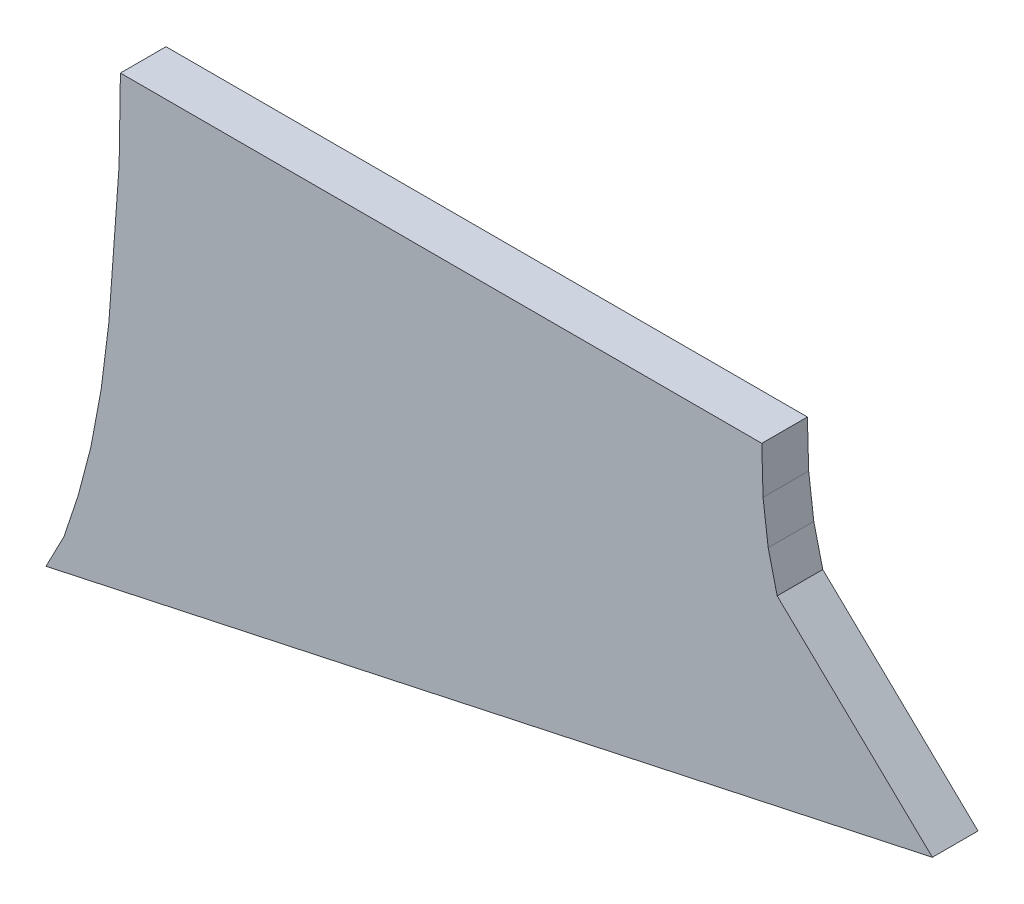
ISO-10303-21;
HEADER;
FILE_DESCRIPTION(('STEP AP214'),'2;1');
FILE_NAME('part.step','',(''),(''),'','','');
FILE_SCHEMA(('AUTOMOTIVE_DESIGN { 1 0 10303 214 1 1 1 1 }'));
ENDSEC;
DATA;
#1=APPLICATION_CONTEXT('core data for automotive mechanical design processes');
#2=APPLICATION_PROTOCOL_DEFINITION('international standard','automotive_design',2000,#1);
#3=PRODUCT_CONTEXT('',#1,'mechanical');
#4=PRODUCT('Part','Part','',(#3));
#5=PRODUCT_RELATED_PRODUCT_CATEGORY('part','',(#4));
#6=PRODUCT_DEFINITION_FORMATION('','',#4);
#7=PRODUCT_DEFINITION_CONTEXT('part definition',#1,'design');
#8=PRODUCT_DEFINITION('design','',#6,#7);
#9=PRODUCT_DEFINITION_SHAPE('','',#8);
#10=(LENGTH_UNIT() NAMED_UNIT(*) SI_UNIT(.MILLI.,.METRE.));
#11=(NAMED_UNIT(*) PLANE_ANGLE_UNIT() SI_UNIT($,.RADIAN.));
#12=(NAMED_UNIT(*) SI_UNIT($,.STERADIAN.) SOLID_ANGLE_UNIT());
#13=UNCERTAINTY_MEASURE_WITH_UNIT(LENGTH_MEASURE(1.E-05),#10,'distance_accuracy_value','');
#14=(GEOMETRIC_REPRESENTATION_CONTEXT(3) GLOBAL_UNCERTAINTY_ASSIGNED_CONTEXT((#13)) GLOBAL_UNIT_ASSIGNED_CONTEXT((#10,
#11,#12)) REPRESENTATION_CONTEXT('',''));
#15=CARTESIAN_POINT('',(0.,0.,0.));
#16=DIRECTION('',(0.,0.,1.));
#17=DIRECTION('',(1.,0.,0.));
#18=AXIS2_PLACEMENT_3D('',#15,#16,#17);
#19=CARTESIAN_POINT('',(78.4339981079102,67.2829971313477,0.));
#20=DIRECTION('',(0.999874169463245,-0.0158633300471945,0.));
#21=DIRECTION('',(-0.0158633300471945,-0.999874169463245,0.));
#22=AXIS2_PLACEMENT_3D('',#19,#20,#21);
#23=PLANE('',#22);
#24=DIRECTION('',(-0.0158633300471945,-0.999874169463245,0.));
#25=VECTOR('',#24,1.);
#26=CARTESIAN_POINT('',(78.4339981079102,67.2829971313477,0.03556));
#27=LINE('',#26,#25);
#28=CARTESIAN_POINT('',(78.4339981079102,67.2829971313477,0.03556));
#29=VERTEX_POINT('',#28);
#30=CARTESIAN_POINT('',(78.4329986572266,67.2200012207031,0.03556));
#31=VERTEX_POINT('',#30);
#32=EDGE_CURVE('E11',#29,#31,#27,.T.);
#33=ORIENTED_EDGE('',*,*,#32,.F.);
#34=DIRECTION('',(0.,0.,1.));
#35=VECTOR('',#34,1.);
#36=CARTESIAN_POINT('',(78.4339981079102,67.2829971313477,0.));
#37=LINE('',#36,#35);
#38=CARTESIAN_POINT('',(78.4339981079102,67.2829971313477,0.));
#39=VERTEX_POINT('',#38);
#40=EDGE_CURVE('E24',#39,#29,#37,.T.);
#41=ORIENTED_EDGE('',*,*,#40,.F.);
#42=DIRECTION('',(-0.0158633300471945,-0.999874169463245,0.));
#43=VECTOR('',#42,1.);
#44=CARTESIAN_POINT('',(78.4339981079102,67.2829971313477,0.));
#45=LINE('',#44,#43);
#46=CARTESIAN_POINT('',(78.4329986572266,67.2200012207031,0.));
#47=VERTEX_POINT('',#46);
#48=EDGE_CURVE('E130',#39,#47,#45,.T.);
#49=ORIENTED_EDGE('',*,*,#48,.T.);
#50=DIRECTION('',(0.,0.,1.));
#51=VECTOR('',#50,1.);
#52=CARTESIAN_POINT('',(78.4329986572266,67.2200012207031,0.));
#53=LINE('',#52,#51);
#54=EDGE_CURVE('E37',#47,#31,#53,.T.);
#55=ORIENTED_EDGE('',*,*,#54,.T.);
#56=EDGE_LOOP('',(#33,#41,#49,#55));
#57=FACE_BOUND('',#56,.T.);
#58=ADVANCED_FACE('F17',(#57),#23,.F.);
#59=CARTESIAN_POINT('',(78.4329986572266,67.2200012207031,0.));
#60=DIRECTION('',(0.997368727839487,-0.0724956600621294,0.));
#61=DIRECTION('',(-0.0724956600621294,-0.997368727839487,0.));
#62=AXIS2_PLACEMENT_3D('',#59,#60,#61);
#63=PLANE('',#62);
#64=DIRECTION('',(-0.0724956600621294,-0.997368727839487,0.));
#65=VECTOR('',#64,1.);
#66=CARTESIAN_POINT('',(78.4329986572266,67.2200012207031,0.03556));
#67=LINE('',#66,#65);
#68=CARTESIAN_POINT('',(78.4250030517578,67.1100006103516,0.03556));
#69=VERTEX_POINT('',#68);
#70=EDGE_CURVE('E210',#31,#69,#67,.T.);
#71=ORIENTED_EDGE('',*,*,#70,.F.);
#72=ORIENTED_EDGE('',*,*,#54,.F.);
#73=DIRECTION('',(-0.0724956600621294,-0.997368727839487,0.));
#74=VECTOR('',#73,1.);
#75=CARTESIAN_POINT('',(78.4329986572266,67.2200012207031,0.));
#76=LINE('',#75,#74);
#77=CARTESIAN_POINT('',(78.4250030517578,67.1100006103516,0.));
#78=VERTEX_POINT('',#77);
#79=EDGE_CURVE('E207',#47,#78,#76,.T.);
#80=ORIENTED_EDGE('',*,*,#79,.T.);
#81=DIRECTION('',(0.,0.,1.));
#82=VECTOR('',#81,1.);
#83=CARTESIAN_POINT('',(78.4250030517578,67.1100006103516,0.));
#84=LINE('',#83,#82);
#85=EDGE_CURVE('E205',#78,#69,#84,.T.);
#86=ORIENTED_EDGE('',*,*,#85,.T.);
#87=EDGE_LOOP('',(#71,#72,#80,#86));
#88=FACE_BOUND('',#87,.T.);
#89=ADVANCED_FACE('F218',(#88),#63,.F.);
#90=CARTESIAN_POINT('',(78.4250030517578,67.1100006103516,0.));
#91=DIRECTION('',(0.992268168867614,-0.124112372679404,0.));
#92=DIRECTION('',(-0.124112372679404,-0.992268168867614,0.));
#93=AXIS2_PLACEMENT_3D('',#90,#91,#92);
#94=PLANE('',#93);
#95=DIRECTION('',(-0.124112372679404,-0.992268168867614,0.));
#96=VECTOR('',#95,1.);
#97=CARTESIAN_POINT('',(78.4250030517578,67.1100006103516,0.03556));
#98=LINE('',#97,#96);
#99=CARTESIAN_POINT('',(78.4189987182617,67.0619964599609,0.03556));
#100=VERTEX_POINT('',#99);
#101=EDGE_CURVE('E202',#69,#100,#98,.T.);
#102=ORIENTED_EDGE('',*,*,#101,.F.);
#103=ORIENTED_EDGE('',*,*,#85,.F.);
#104=DIRECTION('',(-0.124112372679404,-0.992268168867614,0.));
#105=VECTOR('',#104,1.);
#106=CARTESIAN_POINT('',(78.4250030517578,67.1100006103516,0.));
#107=LINE('',#106,#105);
#108=CARTESIAN_POINT('',(78.4189987182617,67.0619964599609,0.));
#109=VERTEX_POINT('',#108);
#110=EDGE_CURVE('E199',#78,#109,#107,.T.);
#111=ORIENTED_EDGE('',*,*,#110,.T.);
#112=DIRECTION('',(0.,0.,1.));
#113=VECTOR('',#112,1.);
#114=CARTESIAN_POINT('',(78.4189987182617,67.0619964599609,0.));
#115=LINE('',#114,#113);
#116=EDGE_CURVE('E197',#109,#100,#115,.T.);
#117=ORIENTED_EDGE('',*,*,#116,.T.);
#118=EDGE_LOOP('',(#102,#103,#111,#117));
#119=FACE_BOUND('',#118,.T.);
#120=ADVANCED_FACE('F224',(#119),#94,.F.);
#121=CARTESIAN_POINT('',(78.4189987182617,67.0619964599609,0.));
#122=DIRECTION('',(0.983147552876486,-0.182813810400028,0.));
#123=DIRECTION('',(-0.182813810400028,-0.983147552876486,0.));
#124=AXIS2_PLACEMENT_3D('',#121,#122,#123);
#125=PLANE('',#124);
#126=DIRECTION('',(-0.182813810400028,-0.983147552876486,0.));
#127=VECTOR('',#126,1.);
#128=CARTESIAN_POINT('',(78.4189987182617,67.0619964599609,0.03556));
#129=LINE('',#128,#127);
#130=CARTESIAN_POINT('',(78.411003112793,67.0189971923828,0.03556));
#131=VERTEX_POINT('',#130);
#132=EDGE_CURVE('E194',#100,#131,#129,.T.);
#133=ORIENTED_EDGE('',*,*,#132,.F.);
#134=ORIENTED_EDGE('',*,*,#116,.F.);
#135=DIRECTION('',(-0.182813810400028,-0.983147552876486,0.));
#136=VECTOR('',#135,1.);
#137=CARTESIAN_POINT('',(78.4189987182617,67.0619964599609,0.));
#138=LINE('',#137,#136);
#139=CARTESIAN_POINT('',(78.411003112793,67.0189971923828,0.));
#140=VERTEX_POINT('',#139);
#141=EDGE_CURVE('E191',#109,#140,#138,.T.);
#142=ORIENTED_EDGE('',*,*,#141,.T.);
#143=DIRECTION('',(0.,0.,1.));
#144=VECTOR('',#143,1.);
#145=CARTESIAN_POINT('',(78.411003112793,67.0189971923828,0.));
#146=LINE('',#145,#144);
#147=EDGE_CURVE('E189',#140,#131,#146,.T.);
#148=ORIENTED_EDGE('',*,*,#147,.T.);
#149=EDGE_LOOP('',(#133,#134,#142,#148));
#150=FACE_BOUND('',#149,.T.);
#151=ADVANCED_FACE('F226',(#150),#125,.F.);
#152=CARTESIAN_POINT('',(78.411003112793,67.0189971923828,0.));
#153=DIRECTION('',(0.967051895040744,-0.254579324176389,0.));
#154=DIRECTION('',(-0.254579324176389,-0.967051895040744,0.));
#155=AXIS2_PLACEMENT_3D('',#152,#153,#154);
#156=PLANE('',#155);
#157=DIRECTION('',(-0.254579324176389,-0.967051895040744,0.));
#158=VECTOR('',#157,1.);
#159=CARTESIAN_POINT('',(78.411003112793,67.0189971923828,0.03556));
#160=LINE('',#159,#158);
#161=CARTESIAN_POINT('',(78.4010009765625,66.9810028076172,0.03556));
#162=VERTEX_POINT('',#161);
#163=EDGE_CURVE('E186',#131,#162,#160,.T.);
#164=ORIENTED_EDGE('',*,*,#163,.F.);
#165=ORIENTED_EDGE('',*,*,#147,.F.);
#166=DIRECTION('',(-0.254579324176389,-0.967051895040744,0.));
#167=VECTOR('',#166,1.);
#168=CARTESIAN_POINT('',(78.411003112793,67.0189971923828,0.));
#169=LINE('',#168,#167);
#170=CARTESIAN_POINT('',(78.4010009765625,66.9810028076172,0.));
#171=VERTEX_POINT('',#170);
#172=EDGE_CURVE('E183',#140,#171,#169,.T.);
#173=ORIENTED_EDGE('',*,*,#172,.T.);
#174=DIRECTION('',(0.,0.,1.));
#175=VECTOR('',#174,1.);
#176=CARTESIAN_POINT('',(78.4010009765625,66.9810028076172,0.));
#177=LINE('',#176,#175);
#178=EDGE_CURVE('E181',#171,#162,#177,.T.);
#179=ORIENTED_EDGE('',*,*,#178,.T.);
#180=EDGE_LOOP('',(#164,#165,#173,#179));
#181=FACE_BOUND('',#180,.T.);
#182=ADVANCED_FACE('F231',(#181),#156,.F.);
#183=CARTESIAN_POINT('',(78.4010009765625,66.9810028076172,0.));
#184=DIRECTION('',(0.948683298050514,-0.316227766016838,0.));
#185=DIRECTION('',(-0.316227766016838,-0.948683298050514,0.));
#186=AXIS2_PLACEMENT_3D('',#183,#184,#185);
#187=PLANE('',#186);
#188=DIRECTION('',(-0.316227766016838,-0.948683298050514,0.));
#189=VECTOR('',#188,1.);
#190=CARTESIAN_POINT('',(78.4010009765625,66.9810028076172,0.03556));
#191=LINE('',#190,#189);
#192=CARTESIAN_POINT('',(78.3899993896484,66.947998046875,0.03556));
#193=VERTEX_POINT('',#192);
#194=EDGE_CURVE('E178',#162,#193,#191,.T.);
#195=ORIENTED_EDGE('',*,*,#194,.F.);
#196=ORIENTED_EDGE('',*,*,#178,.F.);
#197=DIRECTION('',(-0.316227766016838,-0.948683298050514,0.));
#198=VECTOR('',#197,1.);
#199=CARTESIAN_POINT('',(78.4010009765625,66.9810028076172,0.));
#200=LINE('',#199,#198);
#201=CARTESIAN_POINT('',(78.3899993896484,66.947998046875,0.));
#202=VERTEX_POINT('',#201);
#203=EDGE_CURVE('E175',#171,#202,#200,.T.);
#204=ORIENTED_EDGE('',*,*,#203,.T.);
#205=DIRECTION('',(0.,0.,1.));
#206=VECTOR('',#205,1.);
#207=CARTESIAN_POINT('',(78.3899993896484,66.947998046875,0.));
#208=LINE('',#207,#206);
#209=EDGE_CURVE('E173',#202,#193,#208,.T.);
#210=ORIENTED_EDGE('',*,*,#209,.T.);
#211=EDGE_LOOP('',(#195,#196,#204,#210));
#212=FACE_BOUND('',#211,.T.);
#213=ADVANCED_FACE('F234',(#212),#187,.F.);
#214=CARTESIAN_POINT('',(78.3899993896484,66.947998046875,0.));
#215=DIRECTION('',(0.887758328068144,-0.460309842329767,0.));
#216=DIRECTION('',(-0.460309842329767,-0.887758328068144,0.));
#217=AXIS2_PLACEMENT_3D('',#214,#215,#216);
#218=PLANE('',#217);
#219=DIRECTION('',(-0.460309842329767,-0.887758328068144,0.));
#220=VECTOR('',#219,1.);
#221=CARTESIAN_POINT('',(78.3899993896484,66.947998046875,0.03556));
#222=LINE('',#221,#220);
#223=CARTESIAN_POINT('',(78.3759994506836,66.9209976196289,0.03556));
#224=VERTEX_POINT('',#223);
#225=EDGE_CURVE('E170',#193,#224,#222,.T.);
#226=ORIENTED_EDGE('',*,*,#225,.F.);
#227=ORIENTED_EDGE('',*,*,#209,.F.);
#228=DIRECTION('',(-0.460309842329767,-0.887758328068144,0.));
#229=VECTOR('',#228,1.);
#230=CARTESIAN_POINT('',(78.3899993896484,66.947998046875,0.));
#231=LINE('',#230,#229);
#232=CARTESIAN_POINT('',(78.3759994506836,66.9209976196289,0.));
#233=VERTEX_POINT('',#232);
#234=EDGE_CURVE('E167',#202,#233,#231,.T.);
#235=ORIENTED_EDGE('',*,*,#234,.T.);
#236=DIRECTION('',(0.,0.,1.));
#237=VECTOR('',#236,1.);
#238=CARTESIAN_POINT('',(78.3759994506836,66.9209976196289,0.));
#239=LINE('',#238,#237);
#240=EDGE_CURVE('E165',#233,#224,#239,.T.);
#241=ORIENTED_EDGE('',*,*,#240,.T.);
#242=EDGE_LOOP('',(#226,#227,#235,#241));
#243=FACE_BOUND('',#242,.T.);
#244=ADVANCED_FACE('F239',(#243),#218,.F.);
#245=CARTESIAN_POINT('',(78.3759994506836,66.9209976196289,0.));
#246=DIRECTION('',(-0.210787114776266,0.977531990394328,0.));
#247=DIRECTION('',(0.977531990394328,0.210787114776266,0.));
#248=AXIS2_PLACEMENT_3D('',#245,#246,#247);
#249=PLANE('',#248);
#250=DIRECTION('',(0.977531990394328,0.210787114776266,0.));
#251=VECTOR('',#250,1.);
#252=CARTESIAN_POINT('',(78.3759994506836,66.9209976196289,0.03556));
#253=LINE('',#252,#251);
#254=CARTESIAN_POINT('',(79.0670013427734,67.0699996948242,0.03556));
#255=VERTEX_POINT('',#254);
#256=EDGE_CURVE('E162',#224,#255,#253,.T.);
#257=ORIENTED_EDGE('',*,*,#256,.F.);
#258=ORIENTED_EDGE('',*,*,#240,.F.);
#259=DIRECTION('',(0.977531990394328,0.210787114776266,0.));
#260=VECTOR('',#259,1.);
#261=CARTESIAN_POINT('',(78.3759994506836,66.9209976196289,0.));
#262=LINE('',#261,#260);
#263=CARTESIAN_POINT('',(79.0670013427734,67.0699996948242,0.));
#264=VERTEX_POINT('',#263);
#265=EDGE_CURVE('E159',#233,#264,#262,.T.);
#266=ORIENTED_EDGE('',*,*,#265,.T.);
#267=DIRECTION('',(0.,0.,1.));
#268=VECTOR('',#267,1.);
#269=CARTESIAN_POINT('',(79.0670013427734,67.0699996948242,0.));
#270=LINE('',#269,#268);
#271=EDGE_CURVE('E157',#264,#255,#270,.T.);
#272=ORIENTED_EDGE('',*,*,#271,.T.);
#273=EDGE_LOOP('',(#257,#258,#266,#272));
#274=FACE_BOUND('',#273,.T.);
#275=ADVANCED_FACE('F242',(#274),#249,.F.);
#276=CARTESIAN_POINT('',(79.0670013427734,67.0699996948242,0.));
#277=DIRECTION('',(-0.69202002924605,-0.721878299384527,0.));
#278=DIRECTION('',(-0.721878299384527,0.69202002924605,0.));
#279=AXIS2_PLACEMENT_3D('',#276,#277,#278);
#280=PLANE('',#279);
#281=DIRECTION('',(-0.721878299384527,0.69202002924605,0.));
#282=VECTOR('',#281,1.);
#283=CARTESIAN_POINT('',(79.0670013427734,67.0699996948242,0.03556));
#284=LINE('',#283,#282);
#285=CARTESIAN_POINT('',(78.9459991455078,67.1859970092773,0.03556));
#286=VERTEX_POINT('',#285);
#287=EDGE_CURVE('E154',#255,#286,#284,.T.);
#288=ORIENTED_EDGE('',*,*,#287,.F.);
#289=ORIENTED_EDGE('',*,*,#271,.F.);
#290=DIRECTION('',(-0.721878299384527,0.69202002924605,0.));
#291=VECTOR('',#290,1.);
#292=CARTESIAN_POINT('',(79.0670013427734,67.0699996948242,0.));
#293=LINE('',#292,#291);
#294=CARTESIAN_POINT('',(78.9459991455078,67.1859970092773,0.));
#295=VERTEX_POINT('',#294);
#296=EDGE_CURVE('E151',#264,#295,#293,.T.);
#297=ORIENTED_EDGE('',*,*,#296,.T.);
#298=DIRECTION('',(0.,0.,1.));
#299=VECTOR('',#298,1.);
#300=CARTESIAN_POINT('',(78.9459991455078,67.1859970092773,0.));
#301=LINE('',#300,#299);
#302=EDGE_CURVE('E149',#295,#286,#301,.T.);
#303=ORIENTED_EDGE('',*,*,#302,.T.);
#304=EDGE_LOOP('',(#288,#289,#297,#303));
#305=FACE_BOUND('',#304,.T.);
#306=ADVANCED_FACE('F247',(#305),#280,.F.);
#307=CARTESIAN_POINT('',(78.9459991455078,67.1859970092773,0.));
#308=DIRECTION('',(-0.972110362941644,-0.234523862882791,0.));
#309=DIRECTION('',(-0.234523862882791,0.972110362941644,0.));
#310=AXIS2_PLACEMENT_3D('',#307,#308,#309);
#311=PLANE('',#310);
#312=DIRECTION('',(-0.234523862882791,0.972110362941644,0.));
#313=VECTOR('',#312,1.);
#314=CARTESIAN_POINT('',(78.9459991455078,67.1859970092773,0.03556));
#315=LINE('',#314,#313);
#316=CARTESIAN_POINT('',(78.9390029907227,67.2149963378906,0.03556));
#317=VERTEX_POINT('',#316);
#318=EDGE_CURVE('E146',#286,#317,#315,.T.);
#319=ORIENTED_EDGE('',*,*,#318,.F.);
#320=ORIENTED_EDGE('',*,*,#302,.F.);
#321=DIRECTION('',(-0.234523862882791,0.972110362941644,0.));
#322=VECTOR('',#321,1.);
#323=CARTESIAN_POINT('',(78.9459991455078,67.1859970092773,0.));
#324=LINE('',#323,#322);
#325=CARTESIAN_POINT('',(78.9390029907227,67.2149963378906,0.));
#326=VERTEX_POINT('',#325);
#327=EDGE_CURVE('E143',#295,#326,#324,.T.);
#328=ORIENTED_EDGE('',*,*,#327,.T.);
#329=DIRECTION('',(0.,0.,1.));
#330=VECTOR('',#329,1.);
#331=CARTESIAN_POINT('',(78.9390029907227,67.2149963378906,0.));
#332=LINE('',#331,#330);
#333=EDGE_CURVE('E141',#326,#317,#332,.T.);
#334=ORIENTED_EDGE('',*,*,#333,.T.);
#335=EDGE_LOOP('',(#319,#320,#328,#334));
#336=FACE_BOUND('',#335,.T.);
#337=ADVANCED_FACE('F250',(#336),#311,.F.);
#338=CARTESIAN_POINT('',(78.9390029907227,67.2149963378906,0.));
#339=DIRECTION('',(-0.992259671122805,-0.124180292571984,0.));
#340=DIRECTION('',(-0.124180292571984,0.992259671122805,0.));
#341=AXIS2_PLACEMENT_3D('',#338,#339,#340);
#342=PLANE('',#341);
#343=DIRECTION('',(-0.124180292571984,0.992259671122805,0.));
#344=VECTOR('',#343,1.);
#345=CARTESIAN_POINT('',(78.9390029907227,67.2149963378906,0.03556));
#346=LINE('',#345,#344);
#347=CARTESIAN_POINT('',(78.9349975585938,67.2470016479492,0.03556));
#348=VERTEX_POINT('',#347);
#349=EDGE_CURVE('E138',#317,#348,#346,.T.);
#350=ORIENTED_EDGE('',*,*,#349,.F.);
#351=ORIENTED_EDGE('',*,*,#333,.F.);
#352=DIRECTION('',(-0.124180292571984,0.992259671122805,0.));
#353=VECTOR('',#352,1.);
#354=CARTESIAN_POINT('',(78.9390029907227,67.2149963378906,0.));
#355=LINE('',#354,#353);
#356=CARTESIAN_POINT('',(78.9349975585938,67.2470016479492,0.));
#357=VERTEX_POINT('',#356);
#358=EDGE_CURVE('E136',#326,#357,#355,.T.);
#359=ORIENTED_EDGE('',*,*,#358,.T.);
#360=DIRECTION('',(0.,0.,1.));
#361=VECTOR('',#360,1.);
#362=CARTESIAN_POINT('',(78.9349975585938,67.2470016479492,0.));
#363=LINE('',#362,#361);
#364=EDGE_CURVE('E121',#357,#348,#363,.T.);
#365=ORIENTED_EDGE('',*,*,#364,.T.);
#366=EDGE_LOOP('',(#350,#351,#359,#365));
#367=FACE_BOUND('',#366,.T.);
#368=ADVANCED_FACE('F253',(#367),#342,.F.);
#369=CARTESIAN_POINT('',(78.9349975585938,67.2470016479492,0.));
#370=DIRECTION('',(-0.999614747295262,-0.027755305615871,0.));
#371=DIRECTION('',(-0.027755305615871,0.999614747295262,0.));
#372=AXIS2_PLACEMENT_3D('',#369,#370,#371);
#373=PLANE('',#372);
#374=DIRECTION('',(-0.027755305615871,0.999614747295262,0.));
#375=VECTOR('',#374,1.);
#376=CARTESIAN_POINT('',(78.9349975585938,67.2470016479492,0.03556));
#377=LINE('',#376,#375);
#378=CARTESIAN_POINT('',(78.9339981079102,67.2829971313477,0.03556));
#379=VERTEX_POINT('',#378);
#380=EDGE_CURVE('E125',#348,#379,#377,.T.);
#381=ORIENTED_EDGE('',*,*,#380,.F.);
#382=ORIENTED_EDGE('',*,*,#364,.F.);
#383=DIRECTION('',(-0.027755305615871,0.999614747295262,0.));
#384=VECTOR('',#383,1.);
#385=CARTESIAN_POINT('',(78.9349975585938,67.2470016479492,0.));
#386=LINE('',#385,#384);
#387=CARTESIAN_POINT('',(78.9339981079102,67.2829971313477,0.));
#388=VERTEX_POINT('',#387);
#389=EDGE_CURVE('E117',#357,#388,#386,.T.);
#390=ORIENTED_EDGE('',*,*,#389,.T.);
#391=DIRECTION('',(0.,0.,1.));
#392=VECTOR('',#391,1.);
#393=CARTESIAN_POINT('',(78.9339981079102,67.2829971313477,0.));
#394=LINE('',#393,#392);
#395=EDGE_CURVE('E107',#388,#379,#394,.T.);
#396=ORIENTED_EDGE('',*,*,#395,.T.);
#397=EDGE_LOOP('',(#381,#382,#390,#396));
#398=FACE_BOUND('',#397,.T.);
#399=ADVANCED_FACE('F120',(#398),#373,.F.);
#400=CARTESIAN_POINT('',(78.9339981079102,67.2829971313477,0.));
#401=DIRECTION('',(0.,-1.,0.));
#402=DIRECTION('',(-1.,0.,0.));
#403=AXIS2_PLACEMENT_3D('',#400,#401,#402);
#404=PLANE('',#403);
#405=DIRECTION('',(-1.,0.,0.));
#406=VECTOR('',#405,1.);
#407=CARTESIAN_POINT('',(78.9339981079102,67.2829971313477,0.03556));
#408=LINE('',#407,#406);
#409=EDGE_CURVE('E113',#379,#29,#408,.T.);
#410=ORIENTED_EDGE('',*,*,#409,.F.);
#411=ORIENTED_EDGE('',*,*,#395,.F.);
#412=DIRECTION('',(-1.,0.,0.));
#413=VECTOR('',#412,1.);
#414=CARTESIAN_POINT('',(78.9339981079102,67.2829971313477,0.));
#415=LINE('',#414,#413);
#416=EDGE_CURVE('E111',#388,#39,#415,.T.);
#417=ORIENTED_EDGE('',*,*,#416,.T.);
#418=ORIENTED_EDGE('',*,*,#40,.T.);
#419=EDGE_LOOP('',(#410,#411,#417,#418));
#420=FACE_BOUND('',#419,.T.);
#421=ADVANCED_FACE('F109',(#420),#404,.F.);
#422=CARTESIAN_POINT('',(78.4339981079102,67.2829971313477,0.));
#423=DIRECTION('',(0.,0.,1.));
#424=DIRECTION('',(1.,0.,0.));
#425=AXIS2_PLACEMENT_3D('',#422,#423,#424);
#426=PLANE('',#425);
#427=ORIENTED_EDGE('',*,*,#416,.F.);
#428=ORIENTED_EDGE('',*,*,#389,.F.);
#429=ORIENTED_EDGE('',*,*,#358,.F.);
#430=ORIENTED_EDGE('',*,*,#327,.F.);
#431=ORIENTED_EDGE('',*,*,#296,.F.);
#432=ORIENTED_EDGE('',*,*,#265,.F.);
#433=ORIENTED_EDGE('',*,*,#234,.F.);
#434=ORIENTED_EDGE('',*,*,#203,.F.);
#435=ORIENTED_EDGE('',*,*,#172,.F.);
#436=ORIENTED_EDGE('',*,*,#141,.F.);
#437=ORIENTED_EDGE('',*,*,#110,.F.);
#438=ORIENTED_EDGE('',*,*,#79,.F.);
#439=ORIENTED_EDGE('',*,*,#48,.F.);
#440=EDGE_LOOP('',(#427,#428,#429,#430,#431,#432,#433,#434,#435,#436,#437,#438,#439));
#441=FACE_BOUND('',#440,.T.);
#442=ADVANCED_FACE('F128',(#441),#426,.F.);
#443=CARTESIAN_POINT('',(78.4339981079102,67.2829971313477,0.03556));
#444=DIRECTION('',(0.,0.,1.));
#445=DIRECTION('',(1.,0.,0.));
#446=AXIS2_PLACEMENT_3D('',#443,#444,#445);
#447=PLANE('',#446);
#448=ORIENTED_EDGE('',*,*,#32,.T.);
#449=ORIENTED_EDGE('',*,*,#70,.T.);
#450=ORIENTED_EDGE('',*,*,#101,.T.);
#451=ORIENTED_EDGE('',*,*,#132,.T.);
#452=ORIENTED_EDGE('',*,*,#163,.T.);
#453=ORIENTED_EDGE('',*,*,#194,.T.);
#454=ORIENTED_EDGE('',*,*,#225,.T.);
#455=ORIENTED_EDGE('',*,*,#256,.T.);
#456=ORIENTED_EDGE('',*,*,#287,.T.);
#457=ORIENTED_EDGE('',*,*,#318,.T.);
#458=ORIENTED_EDGE('',*,*,#349,.T.);
#459=ORIENTED_EDGE('',*,*,#380,.T.);
#460=ORIENTED_EDGE('',*,*,#409,.T.);
#461=EDGE_LOOP('',(#448,#449,#450,#451,#452,#453,#454,#455,#456,#457,#458,#459,#460));
#462=FACE_BOUND('',#461,.T.);
#463=ADVANCED_FACE('F221',(#462),#447,.T.);
#464=CLOSED_SHELL('',(#58,#89,#120,#151,#182,#213,#244,#275,#306,#337,#368,#399,#421,#442,#463));
#465=MANIFOLD_SOLID_BREP('B1',#464);
#466=ADVANCED_BREP_SHAPE_REPRESENTATION('',(#18,#465),#14);
#467=SHAPE_DEFINITION_REPRESENTATION(#9,#466);
ENDSEC;
END-ISO-10303-21;
